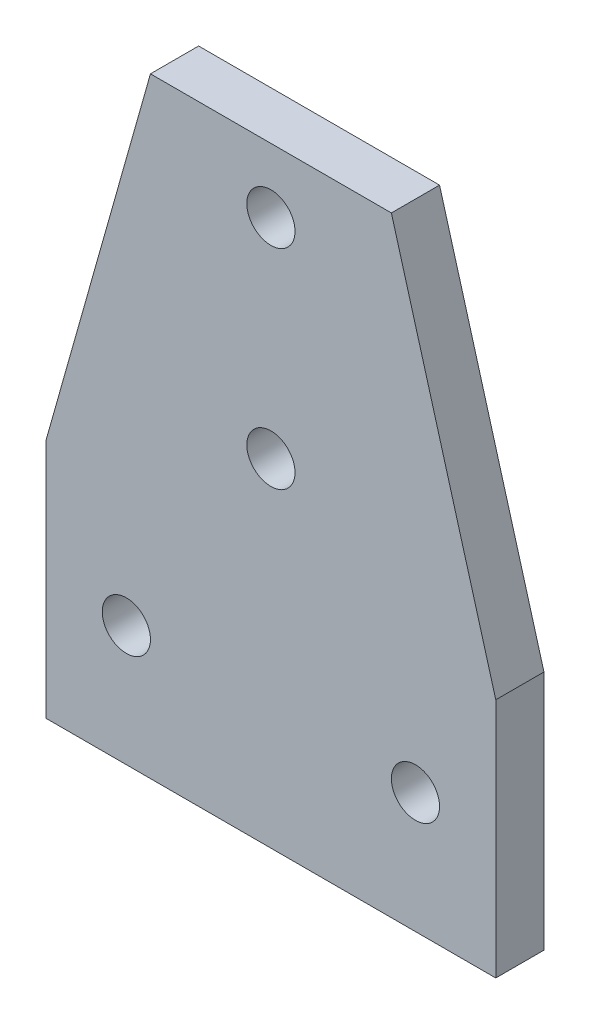
ISO-10303-21;
HEADER;
FILE_DESCRIPTION(('STEP AP214'),'2;1');
FILE_NAME('part.step','',(''),(''),'','','');
FILE_SCHEMA(('AUTOMOTIVE_DESIGN { 1 0 10303 214 1 1 1 1 }'));
ENDSEC;
DATA;
#1=APPLICATION_CONTEXT('core data for automotive mechanical design processes');
#2=APPLICATION_PROTOCOL_DEFINITION('international standard','automotive_design',2000,#1);
#3=PRODUCT_CONTEXT('',#1,'mechanical');
#4=PRODUCT('Part','Part','',(#3));
#5=PRODUCT_RELATED_PRODUCT_CATEGORY('part','',(#4));
#6=PRODUCT_DEFINITION_FORMATION('','',#4);
#7=PRODUCT_DEFINITION_CONTEXT('part definition',#1,'design');
#8=PRODUCT_DEFINITION('design','',#6,#7);
#9=PRODUCT_DEFINITION_SHAPE('','',#8);
#10=(LENGTH_UNIT() NAMED_UNIT(*) SI_UNIT(.MILLI.,.METRE.));
#11=(NAMED_UNIT(*) PLANE_ANGLE_UNIT() SI_UNIT($,.RADIAN.));
#12=(NAMED_UNIT(*) SI_UNIT($,.STERADIAN.) SOLID_ANGLE_UNIT());
#13=UNCERTAINTY_MEASURE_WITH_UNIT(LENGTH_MEASURE(1.E-05),#10,'distance_accuracy_value','');
#14=(GEOMETRIC_REPRESENTATION_CONTEXT(3) GLOBAL_UNCERTAINTY_ASSIGNED_CONTEXT((#13)) GLOBAL_UNIT_ASSIGNED_CONTEXT((#10,
#11,#12)) REPRESENTATION_CONTEXT('',''));
#15=CARTESIAN_POINT('',(0.,0.,0.));
#16=DIRECTION('',(0.,0.,1.));
#17=DIRECTION('',(1.,0.,0.));
#18=AXIS2_PLACEMENT_3D('',#15,#16,#17);
#19=CARTESIAN_POINT('',(32.5,-38.,3.));
#20=DIRECTION('',(0.,1.,0.));
#21=DIRECTION('',(0.,0.,1.));
#22=AXIS2_PLACEMENT_3D('',#19,#20,#21);
#23=PLANE('',#22);
#24=DIRECTION('',(1.,0.,0.));
#25=VECTOR('',#24,1.);
#26=CARTESIAN_POINT('',(32.5,-38.,3.));
#27=LINE('',#26,#25);
#28=CARTESIAN_POINT('',(-6.5,-38.,3.));
#29=VERTEX_POINT('',#28);
#30=CARTESIAN_POINT('',(21.5,-38.,3.));
#31=VERTEX_POINT('',#30);
#32=EDGE_CURVE('E106',#29,#31,#27,.T.);
#33=ORIENTED_EDGE('',*,*,#32,.F.);
#34=DIRECTION('',(0.,0.,1.));
#35=VECTOR('',#34,1.);
#36=CARTESIAN_POINT('',(-6.5,-38.,0.));
#37=LINE('',#36,#35);
#38=CARTESIAN_POINT('',(-6.5,-38.,0.));
#39=VERTEX_POINT('',#38);
#40=EDGE_CURVE('E145',#39,#29,#37,.T.);
#41=ORIENTED_EDGE('',*,*,#40,.F.);
#42=DIRECTION('',(1.,0.,0.));
#43=VECTOR('',#42,1.);
#44=CARTESIAN_POINT('',(32.5,-38.,0.));
#45=LINE('',#44,#43);
#46=CARTESIAN_POINT('',(21.5,-38.,0.));
#47=VERTEX_POINT('',#46);
#48=EDGE_CURVE('E107',#39,#47,#45,.T.);
#49=ORIENTED_EDGE('',*,*,#48,.T.);
#50=DIRECTION('',(0.,0.,1.));
#51=VECTOR('',#50,1.);
#52=CARTESIAN_POINT('',(21.5,-38.,0.));
#53=LINE('',#52,#51);
#54=EDGE_CURVE('E128',#47,#31,#53,.T.);
#55=ORIENTED_EDGE('',*,*,#54,.T.);
#56=EDGE_LOOP('',(#33,#41,#49,#55));
#57=FACE_BOUND('',#56,.T.);
#58=ADVANCED_FACE('F37',(#57),#23,.F.);
#59=CARTESIAN_POINT('',(0.,0.,3.));
#60=DIRECTION('',(0.,-1.,0.));
#61=DIRECTION('',(0.,0.,-1.));
#62=AXIS2_PLACEMENT_3D('',#59,#60,#61);
#63=PLANE('',#62);
#64=DIRECTION('',(-1.,0.,0.));
#65=VECTOR('',#64,1.);
#66=CARTESIAN_POINT('',(0.,0.,0.));
#67=LINE('',#66,#65);
#68=CARTESIAN_POINT('',(15.,0.,0.));
#69=VERTEX_POINT('',#68);
#70=CARTESIAN_POINT('',(0.,0.,0.));
#71=VERTEX_POINT('',#70);
#72=EDGE_CURVE('E100',#69,#71,#67,.T.);
#73=ORIENTED_EDGE('',*,*,#72,.T.);
#74=DIRECTION('',(0.,0.,-1.));
#75=VECTOR('',#74,1.);
#76=CARTESIAN_POINT('',(0.,0.,3.));
#77=LINE('',#76,#75);
#78=CARTESIAN_POINT('',(0.,0.,3.));
#79=VERTEX_POINT('',#78);
#80=EDGE_CURVE('E44',#79,#71,#77,.T.);
#81=ORIENTED_EDGE('',*,*,#80,.F.);
#82=DIRECTION('',(-1.,0.,0.));
#83=VECTOR('',#82,1.);
#84=CARTESIAN_POINT('',(0.,0.,3.));
#85=LINE('',#84,#83);
#86=CARTESIAN_POINT('',(15.,0.,3.));
#87=VERTEX_POINT('',#86);
#88=EDGE_CURVE('E94',#87,#79,#85,.T.);
#89=ORIENTED_EDGE('',*,*,#88,.F.);
#90=DIRECTION('',(0.,0.,-1.));
#91=VECTOR('',#90,1.);
#92=CARTESIAN_POINT('',(15.,0.,3.));
#93=LINE('',#92,#91);
#94=EDGE_CURVE('E11',#87,#69,#93,.T.);
#95=ORIENTED_EDGE('',*,*,#94,.T.);
#96=EDGE_LOOP('',(#73,#81,#89,#95));
#97=FACE_BOUND('',#96,.T.);
#98=ADVANCED_FACE('F105',(#97),#63,.F.);
#99=CARTESIAN_POINT('',(0.,0.,3.));
#100=DIRECTION('',(0.,0.,1.));
#101=DIRECTION('',(1.,0.,0.));
#102=AXIS2_PLACEMENT_3D('',#99,#100,#101);
#103=PLANE('',#102);
#104=DIRECTION('',(0.271957005225948,0.962309403107199,0.));
#105=VECTOR('',#104,1.);
#106=CARTESIAN_POINT('',(0.,0.,3.));
#107=LINE('',#106,#105);
#108=CARTESIAN_POINT('',(-6.5,-23.,3.));
#109=VERTEX_POINT('',#108);
#110=EDGE_CURVE('E89',#109,#79,#107,.T.);
#111=ORIENTED_EDGE('',*,*,#110,.F.);
#112=DIRECTION('',(0.,1.,0.));
#113=VECTOR('',#112,1.);
#114=CARTESIAN_POINT('',(-6.5,-38.,3.));
#115=LINE('',#114,#113);
#116=EDGE_CURVE('E148',#29,#109,#115,.T.);
#117=ORIENTED_EDGE('',*,*,#116,.F.);
#118=ORIENTED_EDGE('',*,*,#32,.T.);
#119=DIRECTION('',(0.,-1.,0.));
#120=VECTOR('',#119,1.);
#121=CARTESIAN_POINT('',(21.5,-38.,3.));
#122=LINE('',#121,#120);
#123=CARTESIAN_POINT('',(21.5,-23.,3.));
#124=VERTEX_POINT('',#123);
#125=EDGE_CURVE('E143',#124,#31,#122,.T.);
#126=ORIENTED_EDGE('',*,*,#125,.F.);
#127=DIRECTION('',(0.271957005225948,-0.962309403107199,0.));
#128=VECTOR('',#127,1.);
#129=CARTESIAN_POINT('',(15.,0.,3.));
#130=LINE('',#129,#128);
#131=EDGE_CURVE('E51',#87,#124,#130,.T.);
#132=ORIENTED_EDGE('',*,*,#131,.F.);
#133=ORIENTED_EDGE('',*,*,#88,.T.);
#134=EDGE_LOOP('',(#111,#117,#118,#126,#132,#133));
#135=FACE_BOUND('',#134,.T.);
#136=CARTESIAN_POINT('',(7.5,-4.,3.));
#137=DIRECTION('',(0.,0.,1.));
#138=DIRECTION('',(1.,0.,0.));
#139=AXIS2_PLACEMENT_3D('',#136,#137,#138);
#140=CIRCLE('',#139,1.5);
#141=CARTESIAN_POINT('',(9.,-4.,3.));
#142=VERTEX_POINT('',#141);
#143=EDGE_CURVE('E123',#142,#142,#140,.T.);
#144=ORIENTED_EDGE('',*,*,#143,.F.);
#145=EDGE_LOOP('',(#144));
#146=FACE_BOUND('',#145,.T.);
#147=CARTESIAN_POINT('',(-1.49999999999999,-30.5,3.));
#148=DIRECTION('',(0.,0.,1.));
#149=DIRECTION('',(1.,0.,0.));
#150=AXIS2_PLACEMENT_3D('',#147,#148,#149);
#151=CIRCLE('',#150,1.5);
#152=CARTESIAN_POINT('',(0.,-30.5,3.));
#153=VERTEX_POINT('',#152);
#154=EDGE_CURVE('E124',#153,#153,#151,.T.);
#155=ORIENTED_EDGE('',*,*,#154,.F.);
#156=EDGE_LOOP('',(#155));
#157=FACE_BOUND('',#156,.T.);
#158=CARTESIAN_POINT('',(16.5,-30.5,3.));
#159=DIRECTION('',(0.,0.,1.));
#160=DIRECTION('',(1.,0.,0.));
#161=AXIS2_PLACEMENT_3D('',#158,#159,#160);
#162=CIRCLE('',#161,1.5);
#163=CARTESIAN_POINT('',(18.,-30.5,3.));
#164=VERTEX_POINT('',#163);
#165=EDGE_CURVE('E131',#164,#164,#162,.T.);
#166=ORIENTED_EDGE('',*,*,#165,.F.);
#167=EDGE_LOOP('',(#166));
#168=FACE_BOUND('',#167,.T.);
#169=CARTESIAN_POINT('',(7.5,-17.,3.));
#170=DIRECTION('',(0.,0.,1.));
#171=DIRECTION('',(1.,0.,0.));
#172=AXIS2_PLACEMENT_3D('',#169,#170,#171);
#173=CIRCLE('',#172,1.5);
#174=CARTESIAN_POINT('',(9.,-17.,3.));
#175=VERTEX_POINT('',#174);
#176=EDGE_CURVE('E116',#175,#175,#173,.T.);
#177=ORIENTED_EDGE('',*,*,#176,.F.);
#178=EDGE_LOOP('',(#177));
#179=FACE_BOUND('',#178,.T.);
#180=ADVANCED_FACE('F161',(#135,#146,#157,#168,#179),#103,.T.);
#181=CARTESIAN_POINT('',(0.,0.,0.));
#182=DIRECTION('',(0.,0.,1.));
#183=DIRECTION('',(1.,0.,0.));
#184=AXIS2_PLACEMENT_3D('',#181,#182,#183);
#185=PLANE('',#184);
#186=CARTESIAN_POINT('',(7.5,-4.,0.));
#187=DIRECTION('',(0.,0.,1.));
#188=DIRECTION('',(1.,0.,0.));
#189=AXIS2_PLACEMENT_3D('',#186,#187,#188);
#190=CIRCLE('',#189,1.5);
#191=CARTESIAN_POINT('',(9.,-4.,0.));
#192=VERTEX_POINT('',#191);
#193=EDGE_CURVE('E112',#192,#192,#190,.T.);
#194=ORIENTED_EDGE('',*,*,#193,.T.);
#195=EDGE_LOOP('',(#194));
#196=FACE_BOUND('',#195,.T.);
#197=CARTESIAN_POINT('',(-1.49999999999999,-30.5,0.));
#198=DIRECTION('',(0.,0.,1.));
#199=DIRECTION('',(1.,0.,0.));
#200=AXIS2_PLACEMENT_3D('',#197,#198,#199);
#201=CIRCLE('',#200,1.5);
#202=CARTESIAN_POINT('',(0.,-30.5,0.));
#203=VERTEX_POINT('',#202);
#204=EDGE_CURVE('E127',#203,#203,#201,.T.);
#205=ORIENTED_EDGE('',*,*,#204,.T.);
#206=EDGE_LOOP('',(#205));
#207=FACE_BOUND('',#206,.T.);
#208=CARTESIAN_POINT('',(16.5,-30.5,0.));
#209=DIRECTION('',(0.,0.,1.));
#210=DIRECTION('',(1.,0.,0.));
#211=AXIS2_PLACEMENT_3D('',#208,#209,#210);
#212=CIRCLE('',#211,1.5);
#213=CARTESIAN_POINT('',(18.,-30.5,0.));
#214=VERTEX_POINT('',#213);
#215=EDGE_CURVE('E120',#214,#214,#212,.T.);
#216=ORIENTED_EDGE('',*,*,#215,.T.);
#217=EDGE_LOOP('',(#216));
#218=FACE_BOUND('',#217,.T.);
#219=CARTESIAN_POINT('',(7.5,-17.,0.));
#220=DIRECTION('',(0.,0.,1.));
#221=DIRECTION('',(1.,0.,0.));
#222=AXIS2_PLACEMENT_3D('',#219,#220,#221);
#223=CIRCLE('',#222,1.5);
#224=CARTESIAN_POINT('',(9.,-17.,0.));
#225=VERTEX_POINT('',#224);
#226=EDGE_CURVE('E119',#225,#225,#223,.T.);
#227=ORIENTED_EDGE('',*,*,#226,.T.);
#228=EDGE_LOOP('',(#227));
#229=FACE_BOUND('',#228,.T.);
#230=DIRECTION('',(0.,1.,0.));
#231=VECTOR('',#230,1.);
#232=CARTESIAN_POINT('',(-6.5,-38.,0.));
#233=LINE('',#232,#231);
#234=CARTESIAN_POINT('',(-6.5,-23.,0.));
#235=VERTEX_POINT('',#234);
#236=EDGE_CURVE('E102',#39,#235,#233,.T.);
#237=ORIENTED_EDGE('',*,*,#236,.T.);
#238=DIRECTION('',(0.271957005225948,0.962309403107199,0.));
#239=VECTOR('',#238,1.);
#240=CARTESIAN_POINT('',(0.,0.,0.));
#241=LINE('',#240,#239);
#242=EDGE_CURVE('E59',#235,#71,#241,.T.);
#243=ORIENTED_EDGE('',*,*,#242,.T.);
#244=ORIENTED_EDGE('',*,*,#72,.F.);
#245=DIRECTION('',(0.271957005225948,-0.962309403107199,0.));
#246=VECTOR('',#245,1.);
#247=CARTESIAN_POINT('',(15.,0.,0.));
#248=LINE('',#247,#246);
#249=CARTESIAN_POINT('',(21.5,-23.,0.));
#250=VERTEX_POINT('',#249);
#251=EDGE_CURVE('E154',#69,#250,#248,.T.);
#252=ORIENTED_EDGE('',*,*,#251,.T.);
#253=DIRECTION('',(0.,-1.,0.));
#254=VECTOR('',#253,1.);
#255=CARTESIAN_POINT('',(21.5,-38.,0.));
#256=LINE('',#255,#254);
#257=EDGE_CURVE('E142',#250,#47,#256,.T.);
#258=ORIENTED_EDGE('',*,*,#257,.T.);
#259=ORIENTED_EDGE('',*,*,#48,.F.);
#260=EDGE_LOOP('',(#237,#243,#244,#252,#258,#259));
#261=FACE_BOUND('',#260,.T.);
#262=ADVANCED_FACE('F98',(#196,#207,#218,#229,#261),#185,.F.);
#263=CARTESIAN_POINT('',(7.5,-17.,0.));
#264=DIRECTION('',(0.,0.,1.));
#265=DIRECTION('',(1.,0.,0.));
#266=AXIS2_PLACEMENT_3D('',#263,#264,#265);
#267=CYLINDRICAL_SURFACE('',#266,1.5);
#268=ORIENTED_EDGE('',*,*,#226,.F.);
#269=EDGE_LOOP('',(#268));
#270=FACE_BOUND('',#269,.T.);
#271=ORIENTED_EDGE('',*,*,#176,.T.);
#272=EDGE_LOOP('',(#271));
#273=FACE_BOUND('',#272,.T.);
#274=ADVANCED_FACE('F190',(#270,#273),#267,.F.);
#275=CARTESIAN_POINT('',(16.5,-30.5,0.));
#276=DIRECTION('',(0.,0.,1.));
#277=DIRECTION('',(1.,0.,0.));
#278=AXIS2_PLACEMENT_3D('',#275,#276,#277);
#279=CYLINDRICAL_SURFACE('',#278,1.5);
#280=ORIENTED_EDGE('',*,*,#215,.F.);
#281=EDGE_LOOP('',(#280));
#282=FACE_BOUND('',#281,.T.);
#283=ORIENTED_EDGE('',*,*,#165,.T.);
#284=EDGE_LOOP('',(#283));
#285=FACE_BOUND('',#284,.T.);
#286=ADVANCED_FACE('F195',(#282,#285),#279,.F.);
#287=CARTESIAN_POINT('',(-1.49999999999999,-30.5,0.));
#288=DIRECTION('',(0.,0.,1.));
#289=DIRECTION('',(1.,0.,0.));
#290=AXIS2_PLACEMENT_3D('',#287,#288,#289);
#291=CYLINDRICAL_SURFACE('',#290,1.5);
#292=ORIENTED_EDGE('',*,*,#204,.F.);
#293=EDGE_LOOP('',(#292));
#294=FACE_BOUND('',#293,.T.);
#295=ORIENTED_EDGE('',*,*,#154,.T.);
#296=EDGE_LOOP('',(#295));
#297=FACE_BOUND('',#296,.T.);
#298=ADVANCED_FACE('F197',(#294,#297),#291,.F.);
#299=CARTESIAN_POINT('',(7.5,-4.,0.));
#300=DIRECTION('',(0.,0.,1.));
#301=DIRECTION('',(1.,0.,0.));
#302=AXIS2_PLACEMENT_3D('',#299,#300,#301);
#303=CYLINDRICAL_SURFACE('',#302,1.5);
#304=ORIENTED_EDGE('',*,*,#193,.F.);
#305=EDGE_LOOP('',(#304));
#306=FACE_BOUND('',#305,.T.);
#307=ORIENTED_EDGE('',*,*,#143,.T.);
#308=EDGE_LOOP('',(#307));
#309=FACE_BOUND('',#308,.T.);
#310=ADVANCED_FACE('F200',(#306,#309),#303,.F.);
#311=CARTESIAN_POINT('',(21.5,-38.,0.));
#312=DIRECTION('',(-1.,0.,0.));
#313=DIRECTION('',(0.,-1.,0.));
#314=AXIS2_PLACEMENT_3D('',#311,#312,#313);
#315=PLANE('',#314);
#316=ORIENTED_EDGE('',*,*,#257,.F.);
#317=DIRECTION('',(0.,0.,1.));
#318=VECTOR('',#317,1.);
#319=CARTESIAN_POINT('',(21.5,-23.,0.));
#320=LINE('',#319,#318);
#321=EDGE_CURVE('E152',#250,#124,#320,.T.);
#322=ORIENTED_EDGE('',*,*,#321,.T.);
#323=ORIENTED_EDGE('',*,*,#125,.T.);
#324=ORIENTED_EDGE('',*,*,#54,.F.);
#325=EDGE_LOOP('',(#316,#322,#323,#324));
#326=FACE_BOUND('',#325,.T.);
#327=ADVANCED_FACE('F170',(#326),#315,.F.);
#328=CARTESIAN_POINT('',(-6.5,-38.,0.));
#329=DIRECTION('',(1.,0.,0.));
#330=DIRECTION('',(0.,1.,0.));
#331=AXIS2_PLACEMENT_3D('',#328,#329,#330);
#332=PLANE('',#331);
#333=ORIENTED_EDGE('',*,*,#116,.T.);
#334=DIRECTION('',(0.,0.,1.));
#335=VECTOR('',#334,1.);
#336=CARTESIAN_POINT('',(-6.5,-23.,0.));
#337=LINE('',#336,#335);
#338=EDGE_CURVE('E103',#235,#109,#337,.T.);
#339=ORIENTED_EDGE('',*,*,#338,.F.);
#340=ORIENTED_EDGE('',*,*,#236,.F.);
#341=ORIENTED_EDGE('',*,*,#40,.T.);
#342=EDGE_LOOP('',(#333,#339,#340,#341));
#343=FACE_BOUND('',#342,.T.);
#344=ADVANCED_FACE('F164',(#343),#332,.F.);
#345=CARTESIAN_POINT('',(0.,0.,0.));
#346=DIRECTION('',(0.962309403107199,-0.271957005225948,0.));
#347=DIRECTION('',(0.271957005225948,0.962309403107199,0.));
#348=AXIS2_PLACEMENT_3D('',#345,#346,#347);
#349=PLANE('',#348);
#350=ORIENTED_EDGE('',*,*,#110,.T.);
#351=ORIENTED_EDGE('',*,*,#80,.T.);
#352=ORIENTED_EDGE('',*,*,#242,.F.);
#353=ORIENTED_EDGE('',*,*,#338,.T.);
#354=EDGE_LOOP('',(#350,#351,#352,#353));
#355=FACE_BOUND('',#354,.T.);
#356=ADVANCED_FACE('F87',(#355),#349,.F.);
#357=CARTESIAN_POINT('',(15.,0.,0.));
#358=DIRECTION('',(-0.962309403107199,-0.271957005225948,0.));
#359=DIRECTION('',(0.271957005225948,-0.962309403107199,0.));
#360=AXIS2_PLACEMENT_3D('',#357,#358,#359);
#361=PLANE('',#360);
#362=ORIENTED_EDGE('',*,*,#131,.T.);
#363=ORIENTED_EDGE('',*,*,#321,.F.);
#364=ORIENTED_EDGE('',*,*,#251,.F.);
#365=ORIENTED_EDGE('',*,*,#94,.F.);
#366=EDGE_LOOP('',(#362,#363,#364,#365));
#367=FACE_BOUND('',#366,.T.);
#368=ADVANCED_FACE('F172',(#367),#361,.F.);
#369=CLOSED_SHELL('',(#58,#98,#180,#262,#274,#286,#298,#310,#327,#344,#356,#368));
#370=MANIFOLD_SOLID_BREP('B2',#369);
#371=ADVANCED_BREP_SHAPE_REPRESENTATION('',(#18,#370),#14);
#372=SHAPE_DEFINITION_REPRESENTATION(#9,#371);
ENDSEC;
END-ISO-10303-21;
